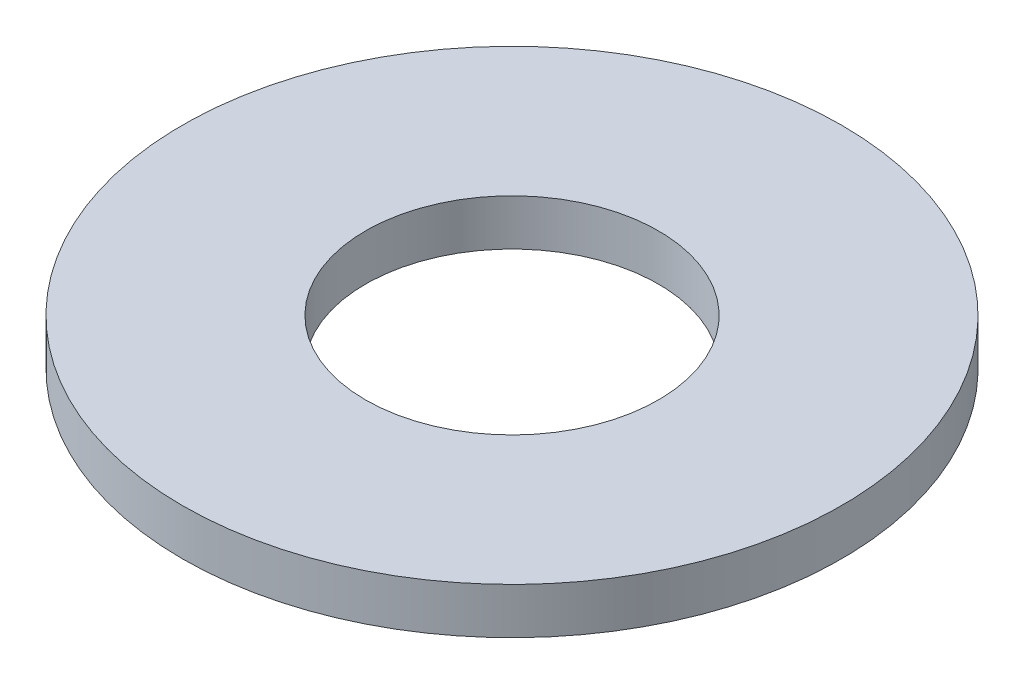
ISO-10303-21;
HEADER;
FILE_DESCRIPTION(('STEP AP214'),'2;1');
FILE_NAME('part.step','',(''),(''),'','','');
FILE_SCHEMA(('AUTOMOTIVE_DESIGN { 1 0 10303 214 1 1 1 1 }'));
ENDSEC;
DATA;
#1=APPLICATION_CONTEXT('core data for automotive mechanical design processes');
#2=APPLICATION_PROTOCOL_DEFINITION('international standard','automotive_design',2000,#1);
#3=PRODUCT_CONTEXT('',#1,'mechanical');
#4=PRODUCT('Part','Part','',(#3));
#5=PRODUCT_RELATED_PRODUCT_CATEGORY('part','',(#4));
#6=PRODUCT_DEFINITION_FORMATION('','',#4);
#7=PRODUCT_DEFINITION_CONTEXT('part definition',#1,'design');
#8=PRODUCT_DEFINITION('design','',#6,#7);
#9=PRODUCT_DEFINITION_SHAPE('','',#8);
#10=(LENGTH_UNIT() NAMED_UNIT(*) SI_UNIT(.MILLI.,.METRE.));
#11=(NAMED_UNIT(*) PLANE_ANGLE_UNIT() SI_UNIT($,.RADIAN.));
#12=(NAMED_UNIT(*) SI_UNIT($,.STERADIAN.) SOLID_ANGLE_UNIT());
#13=UNCERTAINTY_MEASURE_WITH_UNIT(LENGTH_MEASURE(1.E-05),#10,'distance_accuracy_value','');
#14=(GEOMETRIC_REPRESENTATION_CONTEXT(3) GLOBAL_UNCERTAINTY_ASSIGNED_CONTEXT((#13)) GLOBAL_UNIT_ASSIGNED_CONTEXT((#10,
#11,#12)) REPRESENTATION_CONTEXT('',''));
#15=CARTESIAN_POINT('',(0.,0.,0.));
#16=DIRECTION('',(0.,0.,1.));
#17=DIRECTION('',(1.,0.,0.));
#18=AXIS2_PLACEMENT_3D('',#15,#16,#17);
#19=CARTESIAN_POINT('',(0.,0.999999999999959,0.));
#20=DIRECTION('',(0.,1.,0.));
#21=DIRECTION('',(0.,0.,0.999999999999992));
#22=AXIS2_PLACEMENT_3D('',#19,#20,#21);
#23=PLANE('',#22);
#24=CARTESIAN_POINT('',(0.,0.999999999999959,0.));
#25=DIRECTION('',(0.,1.,0.));
#26=DIRECTION('',(0.,0.,0.999999999999992));
#27=AXIS2_PLACEMENT_3D('',#24,#25,#26);
#28=CIRCLE('',#27,7.14375);
#29=CARTESIAN_POINT('',(-3.51701135931395E-13,0.999999999999907,7.14374999999998));
#30=VERTEX_POINT('',#29);
#31=EDGE_CURVE('E10',#30,#30,#28,.T.);
#32=ORIENTED_EDGE('',*,*,#31,.T.);
#33=EDGE_LOOP('',(#32));
#34=FACE_BOUND('',#33,.T.);
#35=CARTESIAN_POINT('',(0.,0.999999999999959,0.));
#36=DIRECTION('',(0.,1.,0.));
#37=DIRECTION('',(0.,0.,0.999999999999992));
#38=AXIS2_PLACEMENT_3D('',#35,#36,#37);
#39=CIRCLE('',#38,3.175);
#40=CARTESIAN_POINT('',(-1.08124852747931E-13,0.999999999999936,3.17500000000001));
#41=VERTEX_POINT('',#40);
#42=EDGE_CURVE('E39',#41,#41,#39,.T.);
#43=ORIENTED_EDGE('',*,*,#42,.F.);
#44=EDGE_LOOP('',(#43));
#45=FACE_BOUND('',#44,.T.);
#46=ADVANCED_FACE('F28',(#34,#45),#23,.T.);
#47=CARTESIAN_POINT('',(0.,0.,0.));
#48=DIRECTION('',(0.,1.,0.));
#49=DIRECTION('',(0.,0.,0.999999999999992));
#50=AXIS2_PLACEMENT_3D('',#47,#48,#49);
#51=PLANE('',#50);
#52=CARTESIAN_POINT('',(0.,0.,0.));
#53=DIRECTION('',(0.,1.,0.));
#54=DIRECTION('',(0.,0.,0.999999999999992));
#55=AXIS2_PLACEMENT_3D('',#52,#53,#54);
#56=CIRCLE('',#55,7.14375);
#57=CARTESIAN_POINT('',(-4.38437309730235E-13,0.,7.14374999999994));
#58=VERTEX_POINT('',#57);
#59=EDGE_CURVE('E32',#58,#58,#56,.T.);
#60=ORIENTED_EDGE('',*,*,#59,.F.);
#61=EDGE_LOOP('',(#60));
#62=FACE_BOUND('',#61,.T.);
#63=CARTESIAN_POINT('',(0.,0.,0.));
#64=DIRECTION('',(0.,1.,0.));
#65=DIRECTION('',(0.,0.,0.999999999999992));
#66=AXIS2_PLACEMENT_3D('',#63,#64,#65);
#67=CIRCLE('',#66,3.175);
#68=CARTESIAN_POINT('',(-1.94861026546771E-13,0.,3.17499999999997));
#69=VERTEX_POINT('',#68);
#70=EDGE_CURVE('E41',#69,#69,#67,.T.);
#71=ORIENTED_EDGE('',*,*,#70,.T.);
#72=EDGE_LOOP('',(#71));
#73=FACE_BOUND('',#72,.T.);
#74=ADVANCED_FACE('F51',(#62,#73),#51,.F.);
#75=CARTESIAN_POINT('',(0.,0.999999999999959,0.));
#76=DIRECTION('',(0.,-1.,0.));
#77=DIRECTION('',(0.,0.,-0.999999999999992));
#78=AXIS2_PLACEMENT_3D('',#75,#76,#77);
#79=CYLINDRICAL_SURFACE('',#78,7.14375);
#80=ORIENTED_EDGE('',*,*,#31,.F.);
#81=EDGE_LOOP('',(#80));
#82=FACE_BOUND('',#81,.T.);
#83=ORIENTED_EDGE('',*,*,#59,.T.);
#84=EDGE_LOOP('',(#83));
#85=FACE_BOUND('',#84,.T.);
#86=ADVANCED_FACE('F30',(#82,#85),#79,.T.);
#87=CARTESIAN_POINT('',(0.,0.999999999999959,0.));
#88=DIRECTION('',(0.,-1.,0.));
#89=DIRECTION('',(0.,0.,-0.999999999999992));
#90=AXIS2_PLACEMENT_3D('',#87,#88,#89);
#91=CYLINDRICAL_SURFACE('',#90,3.175);
#92=ORIENTED_EDGE('',*,*,#42,.T.);
#93=EDGE_LOOP('',(#92));
#94=FACE_BOUND('',#93,.T.);
#95=ORIENTED_EDGE('',*,*,#70,.F.);
#96=EDGE_LOOP('',(#95));
#97=FACE_BOUND('',#96,.T.);
#98=ADVANCED_FACE('F47',(#94,#97),#91,.F.);
#99=CLOSED_SHELL('',(#46,#74,#86,#98));
#100=MANIFOLD_SOLID_BREP('B2',#99);
#101=ADVANCED_BREP_SHAPE_REPRESENTATION('',(#18,#100),#14);
#102=SHAPE_DEFINITION_REPRESENTATION(#9,#101);
ENDSEC;
END-ISO-10303-21;
